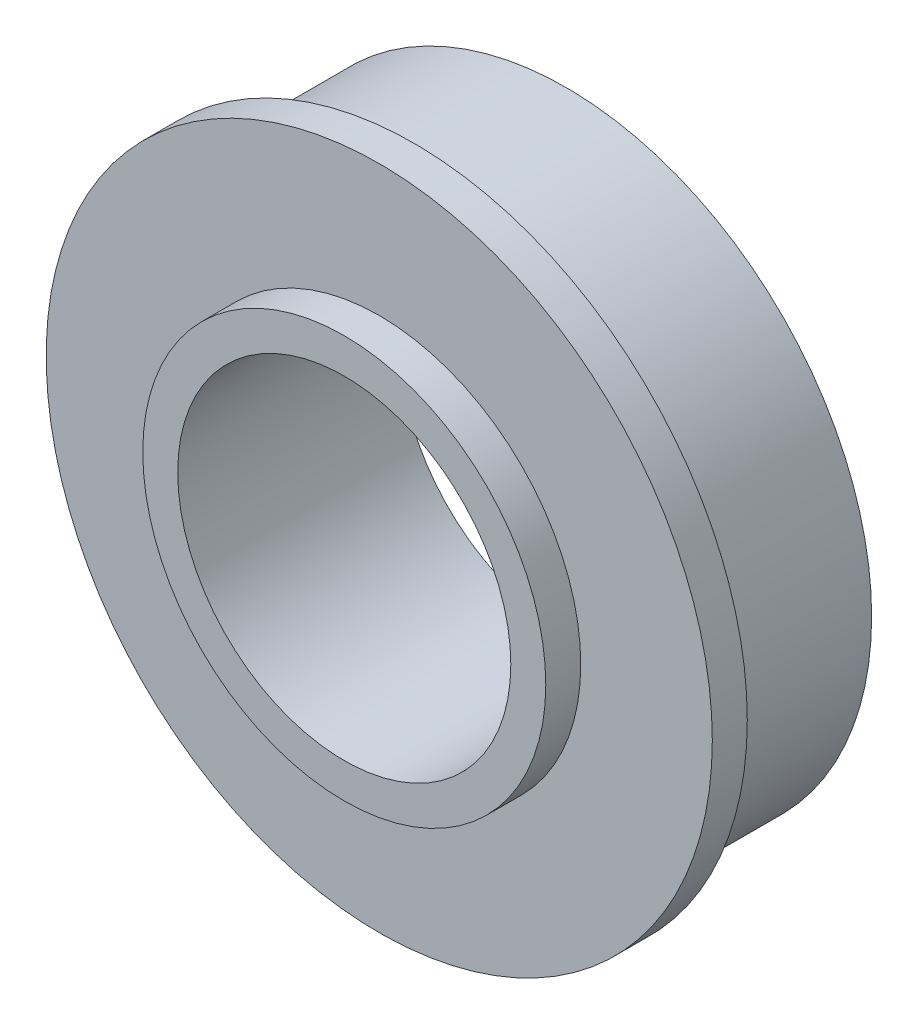
ISO-10303-21;
HEADER;
FILE_DESCRIPTION(('STEP AP214'),'2;1');
FILE_NAME('part.step','',(''),(''),'','','');
FILE_SCHEMA(('AUTOMOTIVE_DESIGN { 1 0 10303 214 1 1 1 1 }'));
ENDSEC;
DATA;
#1=APPLICATION_CONTEXT('core data for automotive mechanical design processes');
#2=APPLICATION_PROTOCOL_DEFINITION('international standard','automotive_design',2000,#1);
#3=PRODUCT_CONTEXT('',#1,'mechanical');
#4=PRODUCT('Part','Part','',(#3));
#5=PRODUCT_RELATED_PRODUCT_CATEGORY('part','',(#4));
#6=PRODUCT_DEFINITION_FORMATION('','',#4);
#7=PRODUCT_DEFINITION_CONTEXT('part definition',#1,'design');
#8=PRODUCT_DEFINITION('design','',#6,#7);
#9=PRODUCT_DEFINITION_SHAPE('','',#8);
#10=(LENGTH_UNIT() NAMED_UNIT(*) SI_UNIT(.MILLI.,.METRE.));
#11=(NAMED_UNIT(*) PLANE_ANGLE_UNIT() SI_UNIT($,.RADIAN.));
#12=(NAMED_UNIT(*) SI_UNIT($,.STERADIAN.) SOLID_ANGLE_UNIT());
#13=UNCERTAINTY_MEASURE_WITH_UNIT(LENGTH_MEASURE(1.E-05),#10,'distance_accuracy_value','');
#14=(GEOMETRIC_REPRESENTATION_CONTEXT(3) GLOBAL_UNCERTAINTY_ASSIGNED_CONTEXT((#13)) GLOBAL_UNIT_ASSIGNED_CONTEXT((#10,
#11,#12)) REPRESENTATION_CONTEXT('',''));
#15=CARTESIAN_POINT('',(0.,0.,0.));
#16=DIRECTION('',(0.,0.,1.));
#17=DIRECTION('',(1.,0.,0.));
#18=AXIS2_PLACEMENT_3D('',#15,#16,#17);
#19=CARTESIAN_POINT('',(0.,0.,10.7));
#20=DIRECTION('',(0.,0.,1.));
#21=DIRECTION('',(1.,0.,0.));
#22=AXIS2_PLACEMENT_3D('',#19,#20,#21);
#23=PLANE('',#22);
#24=CARTESIAN_POINT('',(0.,0.,10.7));
#25=DIRECTION('',(0.,0.,1.));
#26=DIRECTION('',(1.,0.,0.));
#27=AXIS2_PLACEMENT_3D('',#24,#25,#26);
#28=CIRCLE('',#27,19.05);
#29=CARTESIAN_POINT('',(19.05,0.,10.7));
#30=VERTEX_POINT('',#29);
#31=EDGE_CURVE('E56',#30,#30,#28,.T.);
#32=ORIENTED_EDGE('',*,*,#31,.T.);
#33=EDGE_LOOP('',(#32));
#34=FACE_BOUND('',#33,.T.);
#35=CARTESIAN_POINT('',(0.,0.,10.7));
#36=DIRECTION('',(0.,0.,1.));
#37=DIRECTION('',(1.,0.,0.));
#38=AXIS2_PLACEMENT_3D('',#35,#36,#37);
#39=CIRCLE('',#38,11.525);
#40=CARTESIAN_POINT('',(11.525,0.,10.7));
#41=VERTEX_POINT('',#40);
#42=EDGE_CURVE('E63',#41,#41,#39,.T.);
#43=ORIENTED_EDGE('',*,*,#42,.F.);
#44=EDGE_LOOP('',(#43));
#45=FACE_BOUND('',#44,.T.);
#46=ADVANCED_FACE('F41',(#34,#45),#23,.T.);
#47=CARTESIAN_POINT('',(0.,0.,0.));
#48=DIRECTION('',(0.,0.,1.));
#49=DIRECTION('',(1.,0.,0.));
#50=AXIS2_PLACEMENT_3D('',#47,#48,#49);
#51=PLANE('',#50);
#52=CARTESIAN_POINT('',(0.,0.,0.));
#53=DIRECTION('',(0.,0.,1.));
#54=DIRECTION('',(1.,0.,0.));
#55=AXIS2_PLACEMENT_3D('',#52,#53,#54);
#56=CIRCLE('',#55,17.4625);
#57=CARTESIAN_POINT('',(17.4625,0.,0.));
#58=VERTEX_POINT('',#57);
#59=EDGE_CURVE('E45',#58,#58,#56,.T.);
#60=ORIENTED_EDGE('',*,*,#59,.F.);
#61=EDGE_LOOP('',(#60));
#62=FACE_BOUND('',#61,.T.);
#63=CARTESIAN_POINT('',(0.,0.,0.));
#64=DIRECTION('',(0.,0.,1.));
#65=DIRECTION('',(1.,0.,0.));
#66=AXIS2_PLACEMENT_3D('',#63,#64,#65);
#67=CIRCLE('',#66,9.525);
#68=CARTESIAN_POINT('',(9.525,0.,0.));
#69=VERTEX_POINT('',#68);
#70=EDGE_CURVE('E52',#69,#69,#67,.T.);
#71=ORIENTED_EDGE('',*,*,#70,.T.);
#72=EDGE_LOOP('',(#71));
#73=FACE_BOUND('',#72,.T.);
#74=ADVANCED_FACE('F91',(#62,#73),#51,.F.);
#75=CARTESIAN_POINT('',(0.,0.,8.7));
#76=DIRECTION('',(0.,0.,-1.));
#77=DIRECTION('',(-1.,0.,0.));
#78=AXIS2_PLACEMENT_3D('',#75,#76,#77);
#79=CYLINDRICAL_SURFACE('',#78,17.4625);
#80=CARTESIAN_POINT('',(0.,0.,8.7));
#81=DIRECTION('',(0.,0.,1.));
#82=DIRECTION('',(1.,0.,0.));
#83=AXIS2_PLACEMENT_3D('',#80,#81,#82);
#84=CIRCLE('',#83,17.4625);
#85=CARTESIAN_POINT('',(17.4625,0.,8.7));
#86=VERTEX_POINT('',#85);
#87=EDGE_CURVE('E10',#86,#86,#84,.T.);
#88=ORIENTED_EDGE('',*,*,#87,.F.);
#89=EDGE_LOOP('',(#88));
#90=FACE_BOUND('',#89,.T.);
#91=ORIENTED_EDGE('',*,*,#59,.T.);
#92=EDGE_LOOP('',(#91));
#93=FACE_BOUND('',#92,.T.);
#94=ADVANCED_FACE('F43',(#90,#93),#79,.T.);
#95=CARTESIAN_POINT('',(0.,0.,8.7));
#96=DIRECTION('',(0.,0.,-1.));
#97=DIRECTION('',(-1.,0.,0.));
#98=AXIS2_PLACEMENT_3D('',#95,#96,#97);
#99=CYLINDRICAL_SURFACE('',#98,9.525);
#100=ORIENTED_EDGE('',*,*,#70,.F.);
#101=EDGE_LOOP('',(#100));
#102=FACE_BOUND('',#101,.T.);
#103=CARTESIAN_POINT('',(0.,0.,12.7));
#104=DIRECTION('',(0.,0.,1.));
#105=DIRECTION('',(1.,0.,0.));
#106=AXIS2_PLACEMENT_3D('',#103,#104,#105);
#107=CIRCLE('',#106,9.525);
#108=CARTESIAN_POINT('',(9.525,0.,12.7));
#109=VERTEX_POINT('',#108);
#110=EDGE_CURVE('E66',#109,#109,#107,.T.);
#111=ORIENTED_EDGE('',*,*,#110,.T.);
#112=EDGE_LOOP('',(#111));
#113=FACE_BOUND('',#112,.T.);
#114=ADVANCED_FACE('F72',(#102,#113),#99,.F.);
#115=CARTESIAN_POINT('',(0.,0.,8.7));
#116=DIRECTION('',(0.,0.,1.));
#117=DIRECTION('',(1.,0.,0.));
#118=AXIS2_PLACEMENT_3D('',#115,#116,#117);
#119=PLANE('',#118);
#120=ORIENTED_EDGE('',*,*,#87,.T.);
#121=EDGE_LOOP('',(#120));
#122=FACE_BOUND('',#121,.T.);
#123=CARTESIAN_POINT('',(0.,0.,8.7));
#124=DIRECTION('',(0.,0.,1.));
#125=DIRECTION('',(1.,0.,0.));
#126=AXIS2_PLACEMENT_3D('',#123,#124,#125);
#127=CIRCLE('',#126,19.05);
#128=CARTESIAN_POINT('',(19.05,0.,8.7));
#129=VERTEX_POINT('',#128);
#130=EDGE_CURVE('E57',#129,#129,#127,.T.);
#131=ORIENTED_EDGE('',*,*,#130,.F.);
#132=EDGE_LOOP('',(#131));
#133=FACE_BOUND('',#132,.T.);
#134=ADVANCED_FACE('F87',(#122,#133),#119,.F.);
#135=CARTESIAN_POINT('',(0.,0.,10.7));
#136=DIRECTION('',(0.,0.,-1.));
#137=DIRECTION('',(-1.,0.,0.));
#138=AXIS2_PLACEMENT_3D('',#135,#136,#137);
#139=CYLINDRICAL_SURFACE('',#138,19.05);
#140=ORIENTED_EDGE('',*,*,#31,.F.);
#141=EDGE_LOOP('',(#140));
#142=FACE_BOUND('',#141,.T.);
#143=ORIENTED_EDGE('',*,*,#130,.T.);
#144=EDGE_LOOP('',(#143));
#145=FACE_BOUND('',#144,.T.);
#146=ADVANCED_FACE('F77',(#142,#145),#139,.T.);
#147=CARTESIAN_POINT('',(0.,0.,12.7));
#148=DIRECTION('',(0.,0.,1.));
#149=DIRECTION('',(1.,0.,0.));
#150=AXIS2_PLACEMENT_3D('',#147,#148,#149);
#151=PLANE('',#150);
#152=CARTESIAN_POINT('',(0.,0.,12.7));
#153=DIRECTION('',(0.,0.,1.));
#154=DIRECTION('',(1.,0.,0.));
#155=AXIS2_PLACEMENT_3D('',#152,#153,#154);
#156=CIRCLE('',#155,11.525);
#157=CARTESIAN_POINT('',(11.525,0.,12.7));
#158=VERTEX_POINT('',#157);
#159=EDGE_CURVE('E60',#158,#158,#156,.T.);
#160=ORIENTED_EDGE('',*,*,#159,.T.);
#161=EDGE_LOOP('',(#160));
#162=FACE_BOUND('',#161,.T.);
#163=ORIENTED_EDGE('',*,*,#110,.F.);
#164=EDGE_LOOP('',(#163));
#165=FACE_BOUND('',#164,.T.);
#166=ADVANCED_FACE('F74',(#162,#165),#151,.T.);
#167=CARTESIAN_POINT('',(0.,0.,12.7));
#168=DIRECTION('',(0.,0.,-1.));
#169=DIRECTION('',(-1.,0.,0.));
#170=AXIS2_PLACEMENT_3D('',#167,#168,#169);
#171=CYLINDRICAL_SURFACE('',#170,11.525);
#172=ORIENTED_EDGE('',*,*,#159,.F.);
#173=EDGE_LOOP('',(#172));
#174=FACE_BOUND('',#173,.T.);
#175=ORIENTED_EDGE('',*,*,#42,.T.);
#176=EDGE_LOOP('',(#175));
#177=FACE_BOUND('',#176,.T.);
#178=ADVANCED_FACE('F76',(#174,#177),#171,.T.);
#179=CLOSED_SHELL('',(#46,#74,#94,#114,#134,#146,#166,#178));
#180=MANIFOLD_SOLID_BREP('B2',#179);
#181=ADVANCED_BREP_SHAPE_REPRESENTATION('',(#18,#180),#14);
#182=SHAPE_DEFINITION_REPRESENTATION(#9,#181);
ENDSEC;
END-ISO-10303-21;
